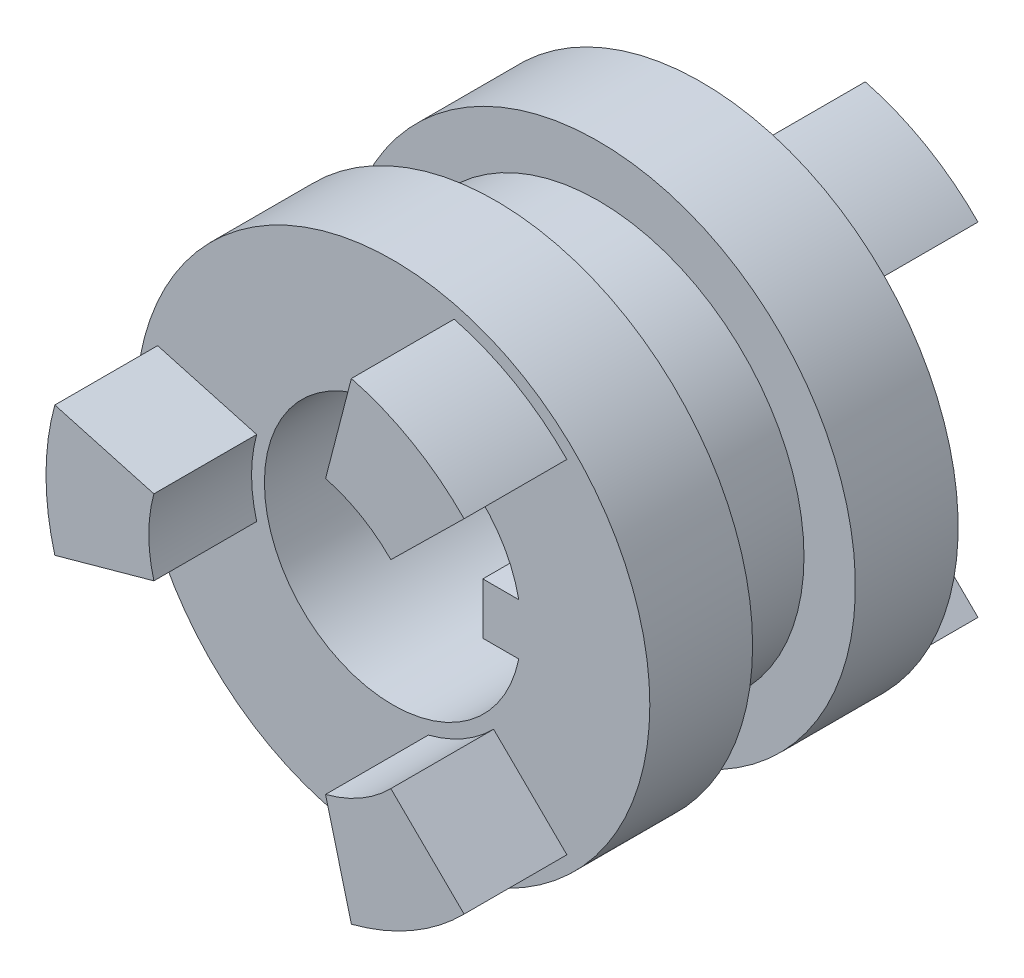
ISO-10303-21;
HEADER;
FILE_DESCRIPTION(('STEP AP214'),'2;1');
FILE_NAME('part.step','',(''),(''),'','','');
FILE_SCHEMA(('AUTOMOTIVE_DESIGN { 1 0 10303 214 1 1 1 1 }'));
ENDSEC;
DATA;
#1=APPLICATION_CONTEXT('core data for automotive mechanical design processes');
#2=APPLICATION_PROTOCOL_DEFINITION('international standard','automotive_design',2000,#1);
#3=PRODUCT_CONTEXT('',#1,'mechanical');
#4=PRODUCT('Part','Part','',(#3));
#5=PRODUCT_RELATED_PRODUCT_CATEGORY('part','',(#4));
#6=PRODUCT_DEFINITION_FORMATION('','',#4);
#7=PRODUCT_DEFINITION_CONTEXT('part definition',#1,'design');
#8=PRODUCT_DEFINITION('design','',#6,#7);
#9=PRODUCT_DEFINITION_SHAPE('','',#8);
#10=(LENGTH_UNIT() NAMED_UNIT(*) SI_UNIT(.MILLI.,.METRE.));
#11=(NAMED_UNIT(*) PLANE_ANGLE_UNIT() SI_UNIT($,.RADIAN.));
#12=(NAMED_UNIT(*) SI_UNIT($,.STERADIAN.) SOLID_ANGLE_UNIT());
#13=UNCERTAINTY_MEASURE_WITH_UNIT(LENGTH_MEASURE(1.E-05),#10,'distance_accuracy_value','');
#14=(GEOMETRIC_REPRESENTATION_CONTEXT(3) GLOBAL_UNCERTAINTY_ASSIGNED_CONTEXT((#13)) GLOBAL_UNIT_ASSIGNED_CONTEXT((#10,
#11,#12)) REPRESENTATION_CONTEXT('',''));
#15=CARTESIAN_POINT('',(0.,0.,0.));
#16=DIRECTION('',(0.,0.,1.));
#17=DIRECTION('',(1.,0.,0.));
#18=AXIS2_PLACEMENT_3D('',#15,#16,#17);
#19=CARTESIAN_POINT('',(0.,0.,4.));
#20=DIRECTION('',(0.,0.,-1.));
#21=DIRECTION('',(-1.,0.,0.));
#22=AXIS2_PLACEMENT_3D('',#19,#20,#21);
#23=CYLINDRICAL_SURFACE('',#22,5.);
#24=CARTESIAN_POINT('',(0.,0.,-8.));
#25=DIRECTION('',(0.,0.,-1.));
#26=DIRECTION('',(-1.,0.,0.));
#27=AXIS2_PLACEMENT_3D('',#24,#25,#26);
#28=CIRCLE('',#27,5.);
#29=CARTESIAN_POINT('',(4.89897948556636,-1.,-8.));
#30=VERTEX_POINT('',#29);
#31=CARTESIAN_POINT('',(4.89897948556636,1.,-8.));
#32=VERTEX_POINT('',#31);
#33=EDGE_CURVE('E338',#30,#32,#28,.T.);
#34=ORIENTED_EDGE('',*,*,#33,.T.);
#35=DIRECTION('',(0.,0.,-1.));
#36=VECTOR('',#35,1.);
#37=CARTESIAN_POINT('',(4.89897948556636,1.,4.));
#38=LINE('',#37,#36);
#39=CARTESIAN_POINT('',(4.89897948556636,1.,4.));
#40=VERTEX_POINT('',#39);
#41=EDGE_CURVE('E50',#40,#32,#38,.T.);
#42=ORIENTED_EDGE('',*,*,#41,.F.);
#43=CARTESIAN_POINT('',(0.,0.,4.));
#44=DIRECTION('',(0.,0.,1.));
#45=DIRECTION('',(1.,0.,0.));
#46=AXIS2_PLACEMENT_3D('',#43,#44,#45);
#47=CIRCLE('',#46,5.);
#48=CARTESIAN_POINT('',(4.89897948556636,-1.,4.));
#49=VERTEX_POINT('',#48);
#50=EDGE_CURVE('E450',#40,#49,#47,.T.);
#51=ORIENTED_EDGE('',*,*,#50,.T.);
#52=DIRECTION('',(0.,0.,-1.));
#53=VECTOR('',#52,1.);
#54=CARTESIAN_POINT('',(4.89897948556636,-1.,4.));
#55=LINE('',#54,#53);
#56=EDGE_CURVE('E38',#30,#49,#55,.F.);
#57=ORIENTED_EDGE('',*,*,#56,.F.);
#58=EDGE_LOOP('',(#34,#42,#51,#57));
#59=FACE_BOUND('',#58,.T.);
#60=ADVANCED_FACE('F34',(#59),#23,.F.);
#61=CARTESIAN_POINT('',(0.,0.,0.));
#62=DIRECTION('',(0.,0.,1.));
#63=DIRECTION('',(1.,0.,0.));
#64=AXIS2_PLACEMENT_3D('',#61,#62,#63);
#65=PLANE('',#64);
#66=CARTESIAN_POINT('',(0.,0.,0.));
#67=DIRECTION('',(0.,0.,1.));
#68=DIRECTION('',(1.,0.,0.));
#69=AXIS2_PLACEMENT_3D('',#66,#67,#68);
#70=CIRCLE('',#69,10.);
#71=CARTESIAN_POINT('',(10.,0.,0.));
#72=VERTEX_POINT('',#71);
#73=EDGE_CURVE('E453',#72,#72,#70,.T.);
#74=ORIENTED_EDGE('',*,*,#73,.F.);
#75=EDGE_LOOP('',(#74));
#76=FACE_BOUND('',#75,.T.);
#77=CARTESIAN_POINT('',(0.,0.,0.));
#78=DIRECTION('',(0.,0.,-1.));
#79=DIRECTION('',(-1.,0.,0.));
#80=AXIS2_PLACEMENT_3D('',#77,#78,#79);
#81=CIRCLE('',#80,8.);
#82=CARTESIAN_POINT('',(-8.,0.,0.));
#83=VERTEX_POINT('',#82);
#84=EDGE_CURVE('E11',#83,#83,#81,.T.);
#85=ORIENTED_EDGE('',*,*,#84,.F.);
#86=EDGE_LOOP('',(#85));
#87=FACE_BOUND('',#86,.T.);
#88=ADVANCED_FACE('F467',(#76,#87),#65,.F.);
#89=CARTESIAN_POINT('',(0.,0.,4.));
#90=DIRECTION('',(0.,0.,1.));
#91=DIRECTION('',(1.,0.,0.));
#92=AXIS2_PLACEMENT_3D('',#89,#90,#91);
#93=PLANE('',#92);
#94=DIRECTION('',(-1.,0.,0.));
#95=VECTOR('',#94,1.);
#96=CARTESIAN_POINT('',(6.5,-1.,4.));
#97=LINE('',#96,#95);
#98=CARTESIAN_POINT('',(3.5,-1.,4.));
#99=VERTEX_POINT('',#98);
#100=EDGE_CURVE('E231',#49,#99,#97,.T.);
#101=ORIENTED_EDGE('',*,*,#100,.F.);
#102=ORIENTED_EDGE('',*,*,#50,.F.);
#103=DIRECTION('',(1.,0.,0.));
#104=VECTOR('',#103,1.);
#105=CARTESIAN_POINT('',(6.5,1.,4.));
#106=LINE('',#105,#104);
#107=CARTESIAN_POINT('',(3.5,1.,4.));
#108=VERTEX_POINT('',#107);
#109=EDGE_CURVE('E350',#108,#40,#106,.T.);
#110=ORIENTED_EDGE('',*,*,#109,.F.);
#111=DIRECTION('',(0.,1.,0.));
#112=VECTOR('',#111,1.);
#113=CARTESIAN_POINT('',(3.5,1.,4.));
#114=LINE('',#113,#112);
#115=EDGE_CURVE('E228',#99,#108,#114,.T.);
#116=ORIENTED_EDGE('',*,*,#115,.F.);
#117=EDGE_LOOP('',(#101,#102,#110,#116));
#118=FACE_BOUND('',#117,.T.);
#119=CARTESIAN_POINT('',(0.,0.,4.));
#120=DIRECTION('',(0.,0.,1.));
#121=DIRECTION('',(1.,0.,0.));
#122=AXIS2_PLACEMENT_3D('',#119,#120,#121);
#123=CIRCLE('',#122,5.5);
#124=CARTESIAN_POINT('',(3.92058984626385,3.85732747603526,4.));
#125=VERTEX_POINT('',#124);
#126=CARTESIAN_POINT('',(1.3802486618295,5.32399414270192,4.));
#127=VERTEX_POINT('',#126);
#128=EDGE_CURVE('E353',#125,#127,#123,.T.);
#129=ORIENTED_EDGE('',*,*,#128,.T.);
#130=DIRECTION('',(0.250954302150848,0.967998935036594,0.));
#131=VECTOR('',#130,1.);
#132=CARTESIAN_POINT('',(-3.16741076286094E-13,0.,4.));
#133=LINE('',#132,#131);
#134=CARTESIAN_POINT('',(2.38406587043289,9.1959898828483,4.));
#135=VERTEX_POINT('',#134);
#136=EDGE_CURVE('E359',#127,#135,#133,.T.);
#137=ORIENTED_EDGE('',*,*,#136,.T.);
#138=CARTESIAN_POINT('',(0.,0.,4.));
#139=DIRECTION('',(0.,0.,1.));
#140=DIRECTION('',(1.,0.,0.));
#141=AXIS2_PLACEMENT_3D('',#138,#139,#140);
#142=CIRCLE('',#141,9.5);
#143=CARTESIAN_POINT('',(6.7719279162738,6.66265654951473,4.));
#144=VERTEX_POINT('',#143);
#145=EDGE_CURVE('E371',#144,#135,#142,.T.);
#146=ORIENTED_EDGE('',*,*,#145,.F.);
#147=DIRECTION('',(0.712834517502549,0.701332268369928,0.));
#148=VECTOR('',#147,1.);
#149=CARTESIAN_POINT('',(-4.08479342547263E-13,4.1517863669842E-13,4.));
#150=LINE('',#149,#148);
#151=EDGE_CURVE('E368',#125,#144,#150,.T.);
#152=ORIENTED_EDGE('',*,*,#151,.F.);
#153=EDGE_LOOP('',(#129,#137,#146,#152));
#154=FACE_BOUND('',#153,.T.);
#155=CARTESIAN_POINT('',(0.,0.,4.));
#156=DIRECTION('',(0.,0.,1.));
#157=DIRECTION('',(1.,0.,0.));
#158=AXIS2_PLACEMENT_3D('',#155,#156,#157);
#159=CIRCLE('',#158,5.5);
#160=CARTESIAN_POINT('',(1.38024866183015,-5.3239941427008,4.));
#161=VERTEX_POINT('',#160);
#162=CARTESIAN_POINT('',(3.9205898462645,-3.85732747603413,4.));
#163=VERTEX_POINT('',#162);
#164=EDGE_CURVE('E386',#161,#163,#159,.T.);
#165=ORIENTED_EDGE('',*,*,#164,.T.);
#166=DIRECTION('',(0.712834517502549,-0.701332268369927,0.));
#167=VECTOR('',#166,1.);
#168=CARTESIAN_POINT('',(4.70526837617733E-13,4.78243746070332E-13,4.));
#169=LINE('',#168,#167);
#170=CARTESIAN_POINT('',(6.7719279162747,-6.66265654951384,4.));
#171=VERTEX_POINT('',#170);
#172=EDGE_CURVE('E391',#163,#171,#169,.T.);
#173=ORIENTED_EDGE('',*,*,#172,.T.);
#174=CARTESIAN_POINT('',(0.,0.,4.));
#175=DIRECTION('',(0.,0.,1.));
#176=DIRECTION('',(1.,0.,0.));
#177=AXIS2_PLACEMENT_3D('',#174,#175,#176);
#178=CIRCLE('',#177,9.5);
#179=CARTESIAN_POINT('',(2.38406587043363,-9.1959898828475,4.));
#180=VERTEX_POINT('',#179);
#181=EDGE_CURVE('E403',#180,#171,#178,.T.);
#182=ORIENTED_EDGE('',*,*,#181,.F.);
#183=DIRECTION('',(0.250954302150849,-0.967998935036594,0.));
#184=VECTOR('',#183,1.);
#185=CARTESIAN_POINT('',(5.63165213834055E-13,1.46000918098134E-13,4.));
#186=LINE('',#185,#184);
#187=EDGE_CURVE('E400',#161,#180,#186,.T.);
#188=ORIENTED_EDGE('',*,*,#187,.F.);
#189=EDGE_LOOP('',(#165,#173,#182,#188));
#190=FACE_BOUND('',#189,.T.);
#191=CARTESIAN_POINT('',(0.,0.,4.));
#192=DIRECTION('',(0.,0.,1.));
#193=DIRECTION('',(1.,0.,0.));
#194=AXIS2_PLACEMENT_3D('',#191,#192,#193);
#195=CIRCLE('',#194,5.5);
#196=CARTESIAN_POINT('',(-5.30083850809369,1.46666666666667,4.));
#197=VERTEX_POINT('',#196);
#198=CARTESIAN_POINT('',(-5.30083850809369,-1.46666666666666,4.));
#199=VERTEX_POINT('',#198);
#200=EDGE_CURVE('E418',#197,#199,#195,.T.);
#201=ORIENTED_EDGE('',*,*,#200,.T.);
#202=DIRECTION('',(-0.963788819653398,-0.266666666666666,0.));
#203=VECTOR('',#202,1.);
#204=CARTESIAN_POINT('',(0.,0.,4.));
#205=LINE('',#204,#203);
#206=CARTESIAN_POINT('',(-9.15599378670728,-2.53333333333333,4.));
#207=VERTEX_POINT('',#206);
#208=EDGE_CURVE('E423',#199,#207,#205,.T.);
#209=ORIENTED_EDGE('',*,*,#208,.T.);
#210=CARTESIAN_POINT('',(0.,0.,4.));
#211=DIRECTION('',(0.,0.,1.));
#212=DIRECTION('',(1.,0.,0.));
#213=AXIS2_PLACEMENT_3D('',#210,#211,#212);
#214=CIRCLE('',#213,9.5);
#215=CARTESIAN_POINT('',(-9.15599378670728,2.53333333333333,4.));
#216=VERTEX_POINT('',#215);
#217=EDGE_CURVE('E435',#216,#207,#214,.T.);
#218=ORIENTED_EDGE('',*,*,#217,.F.);
#219=DIRECTION('',(-0.963788819653397,0.266666666666667,0.));
#220=VECTOR('',#219,1.);
#221=CARTESIAN_POINT('',(0.,0.,4.));
#222=LINE('',#221,#220);
#223=EDGE_CURVE('E432',#197,#216,#222,.T.);
#224=ORIENTED_EDGE('',*,*,#223,.F.);
#225=EDGE_LOOP('',(#201,#209,#218,#224));
#226=FACE_BOUND('',#225,.T.);
#227=CARTESIAN_POINT('',(0.,0.,4.));
#228=DIRECTION('',(0.,0.,1.));
#229=DIRECTION('',(1.,0.,0.));
#230=AXIS2_PLACEMENT_3D('',#227,#228,#229);
#231=CIRCLE('',#230,10.);
#232=CARTESIAN_POINT('',(10.,0.,4.));
#233=VERTEX_POINT('',#232);
#234=EDGE_CURVE('E454',#233,#233,#231,.T.);
#235=ORIENTED_EDGE('',*,*,#234,.T.);
#236=EDGE_LOOP('',(#235));
#237=FACE_BOUND('',#236,.T.);
#238=ADVANCED_FACE('F464',(#118,#154,#190,#226,#237),#93,.T.);
#239=CARTESIAN_POINT('',(0.,0.,4.));
#240=DIRECTION('',(0.,0.,-1.));
#241=DIRECTION('',(-1.,0.,0.));
#242=AXIS2_PLACEMENT_3D('',#239,#240,#241);
#243=CYLINDRICAL_SURFACE('',#242,10.);
#244=ORIENTED_EDGE('',*,*,#234,.F.);
#245=EDGE_LOOP('',(#244));
#246=FACE_BOUND('',#245,.T.);
#247=ORIENTED_EDGE('',*,*,#73,.T.);
#248=EDGE_LOOP('',(#247));
#249=FACE_BOUND('',#248,.T.);
#250=ADVANCED_FACE('F36',(#246,#249),#243,.T.);
#251=CARTESIAN_POINT('',(0.,0.,8.));
#252=DIRECTION('',(0.,0.,-1.));
#253=DIRECTION('',(-1.,0.,0.));
#254=AXIS2_PLACEMENT_3D('',#251,#252,#253);
#255=CYLINDRICAL_SURFACE('',#254,5.5);
#256=ORIENTED_EDGE('',*,*,#200,.F.);
#257=DIRECTION('',(0.,0.,-1.));
#258=VECTOR('',#257,1.);
#259=CARTESIAN_POINT('',(-5.30083850809369,1.46666666666667,8.));
#260=LINE('',#259,#258);
#261=CARTESIAN_POINT('',(-5.30083850809369,1.46666666666667,8.));
#262=VERTEX_POINT('',#261);
#263=EDGE_CURVE('E447',#262,#197,#260,.T.);
#264=ORIENTED_EDGE('',*,*,#263,.F.);
#265=CARTESIAN_POINT('',(0.,0.,8.));
#266=DIRECTION('',(0.,0.,1.));
#267=DIRECTION('',(1.,0.,0.));
#268=AXIS2_PLACEMENT_3D('',#265,#266,#267);
#269=CIRCLE('',#268,5.5);
#270=CARTESIAN_POINT('',(-5.30083850809369,-1.46666666666666,8.));
#271=VERTEX_POINT('',#270);
#272=EDGE_CURVE('E419',#262,#271,#269,.T.);
#273=ORIENTED_EDGE('',*,*,#272,.T.);
#274=DIRECTION('',(0.,0.,-1.));
#275=VECTOR('',#274,1.);
#276=CARTESIAN_POINT('',(-5.30083850809369,-1.46666666666666,8.));
#277=LINE('',#276,#275);
#278=EDGE_CURVE('E430',#271,#199,#277,.T.);
#279=ORIENTED_EDGE('',*,*,#278,.T.);
#280=EDGE_LOOP('',(#256,#264,#273,#279));
#281=FACE_BOUND('',#280,.T.);
#282=ADVANCED_FACE('F475',(#281),#255,.F.);
#283=CARTESIAN_POINT('',(0.,0.,8.));
#284=DIRECTION('',(-0.266666666666667,-0.963788819653397,0.));
#285=DIRECTION('',(0.963788819653397,-0.266666666666667,0.));
#286=AXIS2_PLACEMENT_3D('',#283,#284,#285);
#287=PLANE('',#286);
#288=ORIENTED_EDGE('',*,*,#223,.T.);
#289=DIRECTION('',(0.,0.,-1.));
#290=VECTOR('',#289,1.);
#291=CARTESIAN_POINT('',(-9.15599378670728,2.53333333333333,8.));
#292=LINE('',#291,#290);
#293=CARTESIAN_POINT('',(-9.15599378670728,2.53333333333333,8.));
#294=VERTEX_POINT('',#293);
#295=EDGE_CURVE('E444',#294,#216,#292,.T.);
#296=ORIENTED_EDGE('',*,*,#295,.F.);
#297=DIRECTION('',(-0.963788819653397,0.266666666666667,0.));
#298=VECTOR('',#297,1.);
#299=CARTESIAN_POINT('',(0.,0.,8.));
#300=LINE('',#299,#298);
#301=EDGE_CURVE('E422',#262,#294,#300,.T.);
#302=ORIENTED_EDGE('',*,*,#301,.F.);
#303=ORIENTED_EDGE('',*,*,#263,.T.);
#304=EDGE_LOOP('',(#288,#296,#302,#303));
#305=FACE_BOUND('',#304,.T.);
#306=ADVANCED_FACE('F485',(#305),#287,.F.);
#307=CARTESIAN_POINT('',(0.,0.,8.));
#308=DIRECTION('',(0.,0.,-1.));
#309=DIRECTION('',(-1.,0.,0.));
#310=AXIS2_PLACEMENT_3D('',#307,#308,#309);
#311=CYLINDRICAL_SURFACE('',#310,9.5);
#312=ORIENTED_EDGE('',*,*,#217,.T.);
#313=DIRECTION('',(0.,0.,-1.));
#314=VECTOR('',#313,1.);
#315=CARTESIAN_POINT('',(-9.15599378670728,-2.53333333333333,8.));
#316=LINE('',#315,#314);
#317=CARTESIAN_POINT('',(-9.15599378670728,-2.53333333333333,8.));
#318=VERTEX_POINT('',#317);
#319=EDGE_CURVE('E441',#318,#207,#316,.T.);
#320=ORIENTED_EDGE('',*,*,#319,.F.);
#321=CARTESIAN_POINT('',(0.,0.,8.));
#322=DIRECTION('',(0.,0.,1.));
#323=DIRECTION('',(1.,0.,0.));
#324=AXIS2_PLACEMENT_3D('',#321,#322,#323);
#325=CIRCLE('',#324,9.5);
#326=EDGE_CURVE('E425',#294,#318,#325,.T.);
#327=ORIENTED_EDGE('',*,*,#326,.F.);
#328=ORIENTED_EDGE('',*,*,#295,.T.);
#329=EDGE_LOOP('',(#312,#320,#327,#328));
#330=FACE_BOUND('',#329,.T.);
#331=ADVANCED_FACE('F560',(#330),#311,.T.);
#332=CARTESIAN_POINT('',(0.,0.,8.));
#333=DIRECTION('',(0.266666666666666,-0.963788819653398,0.));
#334=DIRECTION('',(0.963788819653398,0.266666666666666,0.));
#335=AXIS2_PLACEMENT_3D('',#332,#333,#334);
#336=PLANE('',#335);
#337=ORIENTED_EDGE('',*,*,#208,.F.);
#338=ORIENTED_EDGE('',*,*,#278,.F.);
#339=DIRECTION('',(-0.963788819653398,-0.266666666666666,0.));
#340=VECTOR('',#339,1.);
#341=CARTESIAN_POINT('',(0.,0.,8.));
#342=LINE('',#341,#340);
#343=EDGE_CURVE('E427',#271,#318,#342,.T.);
#344=ORIENTED_EDGE('',*,*,#343,.T.);
#345=ORIENTED_EDGE('',*,*,#319,.T.);
#346=EDGE_LOOP('',(#337,#338,#344,#345));
#347=FACE_BOUND('',#346,.T.);
#348=ADVANCED_FACE('F556',(#347),#336,.T.);
#349=CARTESIAN_POINT('',(0.,0.,8.));
#350=DIRECTION('',(0.,0.,1.));
#351=DIRECTION('',(1.,0.,0.));
#352=AXIS2_PLACEMENT_3D('',#349,#350,#351);
#353=PLANE('',#352);
#354=ORIENTED_EDGE('',*,*,#272,.F.);
#355=ORIENTED_EDGE('',*,*,#301,.T.);
#356=ORIENTED_EDGE('',*,*,#326,.T.);
#357=ORIENTED_EDGE('',*,*,#343,.F.);
#358=EDGE_LOOP('',(#354,#355,#356,#357));
#359=FACE_BOUND('',#358,.T.);
#360=ADVANCED_FACE('F552',(#359),#353,.T.);
#361=CARTESIAN_POINT('',(0.,0.,8.));
#362=DIRECTION('',(0.,0.,-1.));
#363=DIRECTION('',(-1.,0.,0.));
#364=AXIS2_PLACEMENT_3D('',#361,#362,#363);
#365=CYLINDRICAL_SURFACE('',#364,5.5);
#366=ORIENTED_EDGE('',*,*,#164,.F.);
#367=DIRECTION('',(0.,0.,-1.));
#368=VECTOR('',#367,1.);
#369=CARTESIAN_POINT('',(1.38024866183015,-5.3239941427008,8.));
#370=LINE('',#369,#368);
#371=CARTESIAN_POINT('',(1.38024866183015,-5.3239941427008,8.));
#372=VERTEX_POINT('',#371);
#373=EDGE_CURVE('E415',#372,#161,#370,.T.);
#374=ORIENTED_EDGE('',*,*,#373,.F.);
#375=CARTESIAN_POINT('',(0.,0.,8.));
#376=DIRECTION('',(0.,0.,1.));
#377=DIRECTION('',(1.,0.,0.));
#378=AXIS2_PLACEMENT_3D('',#375,#376,#377);
#379=CIRCLE('',#378,5.5);
#380=CARTESIAN_POINT('',(3.9205898462645,-3.85732747603413,8.));
#381=VERTEX_POINT('',#380);
#382=EDGE_CURVE('E387',#372,#381,#379,.T.);
#383=ORIENTED_EDGE('',*,*,#382,.T.);
#384=DIRECTION('',(0.,0.,-1.));
#385=VECTOR('',#384,1.);
#386=CARTESIAN_POINT('',(3.9205898462645,-3.85732747603413,8.));
#387=LINE('',#386,#385);
#388=EDGE_CURVE('E398',#381,#163,#387,.T.);
#389=ORIENTED_EDGE('',*,*,#388,.T.);
#390=EDGE_LOOP('',(#366,#374,#383,#389));
#391=FACE_BOUND('',#390,.T.);
#392=ADVANCED_FACE('F548',(#391),#365,.F.);
#393=CARTESIAN_POINT('',(5.63165213834055E-13,1.46000918098134E-13,8.));
#394=DIRECTION('',(0.967998935036594,0.250954302150849,0.));
#395=DIRECTION('',(-0.250954302150849,0.967998935036594,0.));
#396=AXIS2_PLACEMENT_3D('',#393,#394,#395);
#397=PLANE('',#396);
#398=ORIENTED_EDGE('',*,*,#187,.T.);
#399=DIRECTION('',(0.,0.,-1.));
#400=VECTOR('',#399,1.);
#401=CARTESIAN_POINT('',(2.38406587043355,-9.19598988284717,8.));
#402=LINE('',#401,#400);
#403=CARTESIAN_POINT('',(2.38406587043355,-9.19598988284717,8.));
#404=VERTEX_POINT('',#403);
#405=EDGE_CURVE('E412',#404,#180,#402,.T.);
#406=ORIENTED_EDGE('',*,*,#405,.F.);
#407=DIRECTION('',(0.250954302150849,-0.967998935036594,0.));
#408=VECTOR('',#407,1.);
#409=CARTESIAN_POINT('',(5.63165213834055E-13,1.46000918098134E-13,8.));
#410=LINE('',#409,#408);
#411=EDGE_CURVE('E390',#372,#404,#410,.T.);
#412=ORIENTED_EDGE('',*,*,#411,.F.);
#413=ORIENTED_EDGE('',*,*,#373,.T.);
#414=EDGE_LOOP('',(#398,#406,#412,#413));
#415=FACE_BOUND('',#414,.T.);
#416=ADVANCED_FACE('F544',(#415),#397,.F.);
#417=CARTESIAN_POINT('',(0.,0.,8.));
#418=DIRECTION('',(0.,0.,-1.));
#419=DIRECTION('',(-1.,0.,0.));
#420=AXIS2_PLACEMENT_3D('',#417,#418,#419);
#421=CYLINDRICAL_SURFACE('',#420,9.5);
#422=ORIENTED_EDGE('',*,*,#181,.T.);
#423=DIRECTION('',(0.,0.,-1.));
#424=VECTOR('',#423,1.);
#425=CARTESIAN_POINT('',(6.7719279162747,-6.66265654951384,8.));
#426=LINE('',#425,#424);
#427=CARTESIAN_POINT('',(6.7719279162747,-6.66265654951384,8.));
#428=VERTEX_POINT('',#427);
#429=EDGE_CURVE('E409',#428,#171,#426,.T.);
#430=ORIENTED_EDGE('',*,*,#429,.F.);
#431=CARTESIAN_POINT('',(0.,0.,8.));
#432=DIRECTION('',(0.,0.,1.));
#433=DIRECTION('',(1.,0.,0.));
#434=AXIS2_PLACEMENT_3D('',#431,#432,#433);
#435=CIRCLE('',#434,9.5);
#436=EDGE_CURVE('E393',#404,#428,#435,.T.);
#437=ORIENTED_EDGE('',*,*,#436,.F.);
#438=ORIENTED_EDGE('',*,*,#405,.T.);
#439=EDGE_LOOP('',(#422,#430,#437,#438));
#440=FACE_BOUND('',#439,.T.);
#441=ADVANCED_FACE('F540',(#440),#421,.T.);
#442=CARTESIAN_POINT('',(4.70526837617733E-13,4.78243746070332E-13,8.));
#443=DIRECTION('',(0.701332268369927,0.712834517502549,0.));
#444=DIRECTION('',(-0.712834517502549,0.701332268369927,0.));
#445=AXIS2_PLACEMENT_3D('',#442,#443,#444);
#446=PLANE('',#445);
#447=ORIENTED_EDGE('',*,*,#172,.F.);
#448=ORIENTED_EDGE('',*,*,#388,.F.);
#449=DIRECTION('',(0.712834517502549,-0.701332268369927,0.));
#450=VECTOR('',#449,1.);
#451=CARTESIAN_POINT('',(4.70526837617733E-13,4.78243746070332E-13,8.));
#452=LINE('',#451,#450);
#453=EDGE_CURVE('E395',#381,#428,#452,.T.);
#454=ORIENTED_EDGE('',*,*,#453,.T.);
#455=ORIENTED_EDGE('',*,*,#429,.T.);
#456=EDGE_LOOP('',(#447,#448,#454,#455));
#457=FACE_BOUND('',#456,.T.);
#458=ADVANCED_FACE('F536',(#457),#446,.T.);
#459=CARTESIAN_POINT('',(0.,0.,8.));
#460=DIRECTION('',(0.,0.,1.));
#461=DIRECTION('',(1.,0.,0.));
#462=AXIS2_PLACEMENT_3D('',#459,#460,#461);
#463=PLANE('',#462);
#464=ORIENTED_EDGE('',*,*,#382,.F.);
#465=ORIENTED_EDGE('',*,*,#411,.T.);
#466=ORIENTED_EDGE('',*,*,#436,.T.);
#467=ORIENTED_EDGE('',*,*,#453,.F.);
#468=EDGE_LOOP('',(#464,#465,#466,#467));
#469=FACE_BOUND('',#468,.T.);
#470=ADVANCED_FACE('F532',(#469),#463,.T.);
#471=CARTESIAN_POINT('',(0.,0.,8.));
#472=DIRECTION('',(0.,0.,-1.));
#473=DIRECTION('',(-1.,0.,0.));
#474=AXIS2_PLACEMENT_3D('',#471,#472,#473);
#475=CYLINDRICAL_SURFACE('',#474,5.5);
#476=ORIENTED_EDGE('',*,*,#128,.F.);
#477=DIRECTION('',(0.,0.,-1.));
#478=VECTOR('',#477,1.);
#479=CARTESIAN_POINT('',(3.92058984626385,3.85732747603526,8.));
#480=LINE('',#479,#478);
#481=CARTESIAN_POINT('',(3.92058984626385,3.85732747603526,8.));
#482=VERTEX_POINT('',#481);
#483=EDGE_CURVE('E383',#482,#125,#480,.T.);
#484=ORIENTED_EDGE('',*,*,#483,.F.);
#485=CARTESIAN_POINT('',(0.,0.,8.));
#486=DIRECTION('',(0.,0.,1.));
#487=DIRECTION('',(1.,0.,0.));
#488=AXIS2_PLACEMENT_3D('',#485,#486,#487);
#489=CIRCLE('',#488,5.5);
#490=CARTESIAN_POINT('',(1.3802486618295,5.32399414270192,8.));
#491=VERTEX_POINT('',#490);
#492=EDGE_CURVE('E355',#482,#491,#489,.T.);
#493=ORIENTED_EDGE('',*,*,#492,.T.);
#494=DIRECTION('',(0.,0.,-1.));
#495=VECTOR('',#494,1.);
#496=CARTESIAN_POINT('',(1.3802486618295,5.32399414270192,8.));
#497=LINE('',#496,#495);
#498=EDGE_CURVE('E366',#491,#127,#497,.T.);
#499=ORIENTED_EDGE('',*,*,#498,.T.);
#500=EDGE_LOOP('',(#476,#484,#493,#499));
#501=FACE_BOUND('',#500,.T.);
#502=ADVANCED_FACE('F528',(#501),#475,.F.);
#503=CARTESIAN_POINT('',(-4.08479342547263E-13,4.1517863669842E-13,8.));
#504=DIRECTION('',(-0.701332268369928,0.712834517502549,0.));
#505=DIRECTION('',(-0.712834517502549,-0.701332268369928,0.));
#506=AXIS2_PLACEMENT_3D('',#503,#504,#505);
#507=PLANE('',#506);
#508=ORIENTED_EDGE('',*,*,#151,.T.);
#509=DIRECTION('',(0.,0.,-1.));
#510=VECTOR('',#509,1.);
#511=CARTESIAN_POINT('',(6.77192791627404,6.66265654951497,8.));
#512=LINE('',#511,#510);
#513=CARTESIAN_POINT('',(6.77192791627404,6.66265654951497,8.));
#514=VERTEX_POINT('',#513);
#515=EDGE_CURVE('E380',#514,#144,#512,.T.);
#516=ORIENTED_EDGE('',*,*,#515,.F.);
#517=DIRECTION('',(0.712834517502549,0.701332268369928,0.));
#518=VECTOR('',#517,1.);
#519=CARTESIAN_POINT('',(-4.08479342547263E-13,4.1517863669842E-13,8.));
#520=LINE('',#519,#518);
#521=EDGE_CURVE('E358',#482,#514,#520,.T.);
#522=ORIENTED_EDGE('',*,*,#521,.F.);
#523=ORIENTED_EDGE('',*,*,#483,.T.);
#524=EDGE_LOOP('',(#508,#516,#522,#523));
#525=FACE_BOUND('',#524,.T.);
#526=ADVANCED_FACE('F524',(#525),#507,.F.);
#527=CARTESIAN_POINT('',(0.,0.,8.));
#528=DIRECTION('',(0.,0.,-1.));
#529=DIRECTION('',(-1.,0.,0.));
#530=AXIS2_PLACEMENT_3D('',#527,#528,#529);
#531=CYLINDRICAL_SURFACE('',#530,9.5);
#532=ORIENTED_EDGE('',*,*,#145,.T.);
#533=DIRECTION('',(0.,0.,-1.));
#534=VECTOR('',#533,1.);
#535=CARTESIAN_POINT('',(2.38406587043289,9.1959898828483,8.));
#536=LINE('',#535,#534);
#537=CARTESIAN_POINT('',(2.38406587043289,9.1959898828483,8.));
#538=VERTEX_POINT('',#537);
#539=EDGE_CURVE('E377',#538,#135,#536,.T.);
#540=ORIENTED_EDGE('',*,*,#539,.F.);
#541=CARTESIAN_POINT('',(0.,0.,8.));
#542=DIRECTION('',(0.,0.,1.));
#543=DIRECTION('',(1.,0.,0.));
#544=AXIS2_PLACEMENT_3D('',#541,#542,#543);
#545=CIRCLE('',#544,9.5);
#546=EDGE_CURVE('E361',#514,#538,#545,.T.);
#547=ORIENTED_EDGE('',*,*,#546,.F.);
#548=ORIENTED_EDGE('',*,*,#515,.T.);
#549=EDGE_LOOP('',(#532,#540,#547,#548));
#550=FACE_BOUND('',#549,.T.);
#551=ADVANCED_FACE('F520',(#550),#531,.T.);
#552=CARTESIAN_POINT('',(-3.16741076286094E-13,0.,8.));
#553=DIRECTION('',(-0.967998935036594,0.250954302150848,0.));
#554=DIRECTION('',(-0.250954302150848,-0.967998935036594,0.));
#555=AXIS2_PLACEMENT_3D('',#552,#553,#554);
#556=PLANE('',#555);
#557=ORIENTED_EDGE('',*,*,#136,.F.);
#558=ORIENTED_EDGE('',*,*,#498,.F.);
#559=DIRECTION('',(0.250954302150848,0.967998935036594,0.));
#560=VECTOR('',#559,1.);
#561=CARTESIAN_POINT('',(-3.16741076286094E-13,0.,8.));
#562=LINE('',#561,#560);
#563=EDGE_CURVE('E363',#491,#538,#562,.T.);
#564=ORIENTED_EDGE('',*,*,#563,.T.);
#565=ORIENTED_EDGE('',*,*,#539,.T.);
#566=EDGE_LOOP('',(#557,#558,#564,#565));
#567=FACE_BOUND('',#566,.T.);
#568=ADVANCED_FACE('F516',(#567),#556,.T.);
#569=CARTESIAN_POINT('',(0.,0.,8.));
#570=DIRECTION('',(0.,0.,1.));
#571=DIRECTION('',(1.,0.,0.));
#572=AXIS2_PLACEMENT_3D('',#569,#570,#571);
#573=PLANE('',#572);
#574=ORIENTED_EDGE('',*,*,#492,.F.);
#575=ORIENTED_EDGE('',*,*,#521,.T.);
#576=ORIENTED_EDGE('',*,*,#546,.T.);
#577=ORIENTED_EDGE('',*,*,#563,.F.);
#578=EDGE_LOOP('',(#574,#575,#576,#577));
#579=FACE_BOUND('',#578,.T.);
#580=ADVANCED_FACE('F513',(#579),#573,.T.);
#581=CARTESIAN_POINT('',(3.5,1.,4.));
#582=DIRECTION('',(-1.,0.,0.));
#583=DIRECTION('',(0.,0.,1.));
#584=AXIS2_PLACEMENT_3D('',#581,#582,#583);
#585=PLANE('',#584);
#586=DIRECTION('',(0.,0.,-1.));
#587=VECTOR('',#586,1.);
#588=CARTESIAN_POINT('',(3.5,1.,4.));
#589=LINE('',#588,#587);
#590=CARTESIAN_POINT('',(3.5,1.,-8.));
#591=VERTEX_POINT('',#590);
#592=EDGE_CURVE('E221',#108,#591,#589,.T.);
#593=ORIENTED_EDGE('',*,*,#592,.T.);
#594=DIRECTION('',(0.,-1.,0.));
#595=VECTOR('',#594,1.);
#596=CARTESIAN_POINT('',(3.5,0.499999999999999,-8.));
#597=LINE('',#596,#595);
#598=CARTESIAN_POINT('',(3.5,-1.,-8.));
#599=VERTEX_POINT('',#598);
#600=EDGE_CURVE('E225',#591,#599,#597,.T.);
#601=ORIENTED_EDGE('',*,*,#600,.T.);
#602=DIRECTION('',(0.,0.,-1.));
#603=VECTOR('',#602,1.);
#604=CARTESIAN_POINT('',(3.5,-1.,4.));
#605=LINE('',#604,#603);
#606=EDGE_CURVE('E230',#99,#599,#605,.T.);
#607=ORIENTED_EDGE('',*,*,#606,.F.);
#608=ORIENTED_EDGE('',*,*,#115,.T.);
#609=EDGE_LOOP('',(#593,#601,#607,#608));
#610=FACE_BOUND('',#609,.T.);
#611=ADVANCED_FACE('F223',(#610),#585,.T.);
#612=CARTESIAN_POINT('',(6.5,-1.,4.));
#613=DIRECTION('',(0.,-1.,0.));
#614=DIRECTION('',(0.,0.,-1.));
#615=AXIS2_PLACEMENT_3D('',#612,#613,#614);
#616=PLANE('',#615);
#617=ORIENTED_EDGE('',*,*,#606,.T.);
#618=DIRECTION('',(1.,0.,0.));
#619=VECTOR('',#618,1.);
#620=CARTESIAN_POINT('',(4.89897948556636,-1.,-8.));
#621=LINE('',#620,#619);
#622=EDGE_CURVE('E239',#599,#30,#621,.T.);
#623=ORIENTED_EDGE('',*,*,#622,.T.);
#624=ORIENTED_EDGE('',*,*,#56,.T.);
#625=ORIENTED_EDGE('',*,*,#100,.T.);
#626=EDGE_LOOP('',(#617,#623,#624,#625));
#627=FACE_BOUND('',#626,.T.);
#628=ADVANCED_FACE('F460',(#627),#616,.T.);
#629=CARTESIAN_POINT('',(6.5,1.,4.));
#630=DIRECTION('',(0.,1.,0.));
#631=DIRECTION('',(0.,0.,1.));
#632=AXIS2_PLACEMENT_3D('',#629,#630,#631);
#633=PLANE('',#632);
#634=DIRECTION('',(-1.,0.,0.));
#635=VECTOR('',#634,1.);
#636=CARTESIAN_POINT('',(0.,1.,-8.));
#637=LINE('',#636,#635);
#638=EDGE_CURVE('E237',#32,#591,#637,.T.);
#639=ORIENTED_EDGE('',*,*,#638,.T.);
#640=ORIENTED_EDGE('',*,*,#592,.F.);
#641=ORIENTED_EDGE('',*,*,#109,.T.);
#642=ORIENTED_EDGE('',*,*,#41,.T.);
#643=EDGE_LOOP('',(#639,#640,#641,#642));
#644=FACE_BOUND('',#643,.T.);
#645=ADVANCED_FACE('F242',(#644),#633,.T.);
#646=CARTESIAN_POINT('',(0.,0.,-4.));
#647=DIRECTION('',(0.,0.,1.));
#648=DIRECTION('',(1.,0.,0.));
#649=AXIS2_PLACEMENT_3D('',#646,#647,#648);
#650=CYLINDRICAL_SURFACE('',#649,8.);
#651=CARTESIAN_POINT('',(0.,0.,-4.));
#652=DIRECTION('',(0.,0.,-1.));
#653=DIRECTION('',(-1.,0.,0.));
#654=AXIS2_PLACEMENT_3D('',#651,#652,#653);
#655=CIRCLE('',#654,8.);
#656=CARTESIAN_POINT('',(-8.,0.,-4.));
#657=VERTEX_POINT('',#656);
#658=EDGE_CURVE('E344',#657,#657,#655,.T.);
#659=ORIENTED_EDGE('',*,*,#658,.F.);
#660=EDGE_LOOP('',(#659));
#661=FACE_BOUND('',#660,.T.);
#662=ORIENTED_EDGE('',*,*,#84,.T.);
#663=EDGE_LOOP('',(#662));
#664=FACE_BOUND('',#663,.T.);
#665=ADVANCED_FACE('F493',(#661,#664),#650,.T.);
#666=CARTESIAN_POINT('',(0.,0.,-4.));
#667=DIRECTION('',(0.,0.,-1.));
#668=DIRECTION('',(-1.,0.,0.));
#669=AXIS2_PLACEMENT_3D('',#666,#667,#668);
#670=PLANE('',#669);
#671=CARTESIAN_POINT('',(0.,0.,-4.));
#672=DIRECTION('',(0.,0.,-1.));
#673=DIRECTION('',(-1.,0.,0.));
#674=AXIS2_PLACEMENT_3D('',#671,#672,#673);
#675=CIRCLE('',#674,10.);
#676=CARTESIAN_POINT('',(-10.,0.,-4.));
#677=VERTEX_POINT('',#676);
#678=EDGE_CURVE('E340',#677,#677,#675,.T.);
#679=ORIENTED_EDGE('',*,*,#678,.F.);
#680=EDGE_LOOP('',(#679));
#681=FACE_BOUND('',#680,.T.);
#682=ORIENTED_EDGE('',*,*,#658,.T.);
#683=EDGE_LOOP('',(#682));
#684=FACE_BOUND('',#683,.T.);
#685=ADVANCED_FACE('F495',(#681,#684),#670,.F.);
#686=CARTESIAN_POINT('',(0.,0.,-8.));
#687=DIRECTION('',(0.,0.,-1.));
#688=DIRECTION('',(-1.,0.,0.));
#689=AXIS2_PLACEMENT_3D('',#686,#687,#688);
#690=PLANE('',#689);
#691=ORIENTED_EDGE('',*,*,#600,.F.);
#692=ORIENTED_EDGE('',*,*,#638,.F.);
#693=ORIENTED_EDGE('',*,*,#33,.F.);
#694=ORIENTED_EDGE('',*,*,#622,.F.);
#695=EDGE_LOOP('',(#691,#692,#693,#694));
#696=FACE_BOUND('',#695,.T.);
#697=CARTESIAN_POINT('',(0.,0.,-8.));
#698=DIRECTION('',(0.,0.,-1.));
#699=DIRECTION('',(-1.,0.,0.));
#700=AXIS2_PLACEMENT_3D('',#697,#698,#699);
#701=CIRCLE('',#700,5.49999999999984);
#702=CARTESIAN_POINT('',(-5.30083850809434,-1.46666666666648,-8.));
#703=VERTEX_POINT('',#702);
#704=CARTESIAN_POINT('',(-5.30083850809434,1.46666666666685,-8.));
#705=VERTEX_POINT('',#704);
#706=EDGE_CURVE('E243',#703,#705,#701,.T.);
#707=ORIENTED_EDGE('',*,*,#706,.T.);
#708=DIRECTION('',(-0.963788819653397,0.266666666666666,0.));
#709=VECTOR('',#708,1.);
#710=CARTESIAN_POINT('',(0.,0.,-8.));
#711=LINE('',#710,#709);
#712=CARTESIAN_POINT('',(-9.15599378670817,2.53333333333358,-8.));
#713=VERTEX_POINT('',#712);
#714=EDGE_CURVE('E251',#705,#713,#711,.T.);
#715=ORIENTED_EDGE('',*,*,#714,.T.);
#716=CARTESIAN_POINT('',(0.,0.,-8.));
#717=DIRECTION('',(0.,0.,-1.));
#718=DIRECTION('',(-1.,0.,0.));
#719=AXIS2_PLACEMENT_3D('',#716,#717,#718);
#720=CIRCLE('',#719,9.50000000000001);
#721=CARTESIAN_POINT('',(-9.15599378670738,-2.533333333333,-8.));
#722=VERTEX_POINT('',#721);
#723=EDGE_CURVE('E260',#722,#713,#720,.T.);
#724=ORIENTED_EDGE('',*,*,#723,.F.);
#725=DIRECTION('',(-0.963788819653397,-0.266666666666668,0.));
#726=VECTOR('',#725,1.);
#727=CARTESIAN_POINT('',(0.,3.44412860815365E-13,-8.));
#728=LINE('',#727,#726);
#729=EDGE_CURVE('E58',#703,#722,#728,.T.);
#730=ORIENTED_EDGE('',*,*,#729,.F.);
#731=EDGE_LOOP('',(#707,#715,#724,#730));
#732=FACE_BOUND('',#731,.T.);
#733=CARTESIAN_POINT('',(0.,0.,-8.));
#734=DIRECTION('',(0.,0.,-1.));
#735=DIRECTION('',(-1.,0.,0.));
#736=AXIS2_PLACEMENT_3D('',#733,#734,#735);
#737=CIRCLE('',#736,5.49999999999984);
#738=CARTESIAN_POINT('',(3.92058984626402,-3.85732747603461,-8.));
#739=VERTEX_POINT('',#738);
#740=CARTESIAN_POINT('',(1.38024866182966,-5.32399414270127,-8.));
#741=VERTEX_POINT('',#740);
#742=EDGE_CURVE('E274',#739,#741,#737,.T.);
#743=ORIENTED_EDGE('',*,*,#742,.T.);
#744=DIRECTION('',(0.250954302150849,-0.967998935036594,0.));
#745=VECTOR('',#744,1.);
#746=CARTESIAN_POINT('',(0.,0.,-8.));
#747=LINE('',#746,#745);
#748=CARTESIAN_POINT('',(2.38406587043312,-9.1959898828479,-8.));
#749=VERTEX_POINT('',#748);
#750=EDGE_CURVE('E279',#741,#749,#747,.T.);
#751=ORIENTED_EDGE('',*,*,#750,.T.);
#752=CARTESIAN_POINT('',(0.,0.,-8.));
#753=DIRECTION('',(0.,0.,-1.));
#754=DIRECTION('',(-1.,0.,0.));
#755=AXIS2_PLACEMENT_3D('',#752,#753,#754);
#756=CIRCLE('',#755,9.50000000000001);
#757=CARTESIAN_POINT('',(6.77192791627422,-6.66265654951432,-8.));
#758=VERTEX_POINT('',#757);
#759=EDGE_CURVE('E291',#758,#749,#756,.T.);
#760=ORIENTED_EDGE('',*,*,#759,.F.);
#761=DIRECTION('',(0.71283451750255,-0.701332268369927,0.));
#762=VECTOR('',#761,1.);
#763=CARTESIAN_POINT('',(0.,0.,-8.));
#764=LINE('',#763,#762);
#765=EDGE_CURVE('E288',#739,#758,#764,.T.);
#766=ORIENTED_EDGE('',*,*,#765,.F.);
#767=EDGE_LOOP('',(#743,#751,#760,#766));
#768=FACE_BOUND('',#767,.T.);
#769=CARTESIAN_POINT('',(0.,0.,-8.));
#770=DIRECTION('',(0.,0.,-1.));
#771=DIRECTION('',(-1.,0.,0.));
#772=AXIS2_PLACEMENT_3D('',#769,#770,#771);
#773=CIRCLE('',#772,5.49999999999984);
#774=CARTESIAN_POINT('',(1.3802486618295,5.32399414270192,-8.));
#775=VERTEX_POINT('',#774);
#776=CARTESIAN_POINT('',(3.92058984626385,3.85732747603526,-8.));
#777=VERTEX_POINT('',#776);
#778=EDGE_CURVE('E306',#775,#777,#773,.T.);
#779=ORIENTED_EDGE('',*,*,#778,.T.);
#780=DIRECTION('',(0.712834517502549,0.701332268369928,0.));
#781=VECTOR('',#780,1.);
#782=CARTESIAN_POINT('',(-4.08175188159663E-13,4.1486949400542E-13,-8.));
#783=LINE('',#782,#781);
#784=CARTESIAN_POINT('',(6.77192791627423,6.66265654951515,-8.));
#785=VERTEX_POINT('',#784);
#786=EDGE_CURVE('E311',#777,#785,#783,.T.);
#787=ORIENTED_EDGE('',*,*,#786,.T.);
#788=CARTESIAN_POINT('',(0.,0.,-8.));
#789=DIRECTION('',(0.,0.,-1.));
#790=DIRECTION('',(-1.,0.,0.));
#791=AXIS2_PLACEMENT_3D('',#788,#789,#790);
#792=CIRCLE('',#791,9.50000000000001);
#793=CARTESIAN_POINT('',(2.38406587043274,9.19598988284774,-8.));
#794=VERTEX_POINT('',#793);
#795=EDGE_CURVE('E323',#794,#785,#792,.T.);
#796=ORIENTED_EDGE('',*,*,#795,.F.);
#797=DIRECTION('',(0.250954302150847,0.967998935036595,0.));
#798=VECTOR('',#797,1.);
#799=CARTESIAN_POINT('',(-3.07925221280119E-13,0.,-8.));
#800=LINE('',#799,#798);
#801=EDGE_CURVE('E320',#775,#794,#800,.T.);
#802=ORIENTED_EDGE('',*,*,#801,.F.);
#803=EDGE_LOOP('',(#779,#787,#796,#802));
#804=FACE_BOUND('',#803,.T.);
#805=CARTESIAN_POINT('',(0.,0.,-8.));
#806=DIRECTION('',(0.,0.,-1.));
#807=DIRECTION('',(-1.,0.,0.));
#808=AXIS2_PLACEMENT_3D('',#805,#806,#807);
#809=CIRCLE('',#808,10.);
#810=CARTESIAN_POINT('',(-10.,0.,-8.));
#811=VERTEX_POINT('',#810);
#812=EDGE_CURVE('E341',#811,#811,#809,.T.);
#813=ORIENTED_EDGE('',*,*,#812,.T.);
#814=EDGE_LOOP('',(#813));
#815=FACE_BOUND('',#814,.T.);
#816=ADVANCED_FACE('F235',(#696,#732,#768,#804,#815),#690,.T.);
#817=CARTESIAN_POINT('',(0.,0.,-8.));
#818=DIRECTION('',(0.,0.,1.));
#819=DIRECTION('',(1.,0.,0.));
#820=AXIS2_PLACEMENT_3D('',#817,#818,#819);
#821=CYLINDRICAL_SURFACE('',#820,10.);
#822=ORIENTED_EDGE('',*,*,#812,.F.);
#823=EDGE_LOOP('',(#822));
#824=FACE_BOUND('',#823,.T.);
#825=ORIENTED_EDGE('',*,*,#678,.T.);
#826=EDGE_LOOP('',(#825));
#827=FACE_BOUND('',#826,.T.);
#828=ADVANCED_FACE('F508',(#824,#827),#821,.T.);
#829=CARTESIAN_POINT('',(0.,0.,-12.));
#830=DIRECTION('',(0.,0.,1.));
#831=DIRECTION('',(1.,0.,0.));
#832=AXIS2_PLACEMENT_3D('',#829,#830,#831);
#833=CYLINDRICAL_SURFACE('',#832,5.49999999999984);
#834=ORIENTED_EDGE('',*,*,#778,.F.);
#835=DIRECTION('',(0.,0.,1.));
#836=VECTOR('',#835,1.);
#837=CARTESIAN_POINT('',(1.3802486618295,5.32399414270192,-12.));
#838=LINE('',#837,#836);
#839=CARTESIAN_POINT('',(1.3802486618295,5.32399414270192,-12.));
#840=VERTEX_POINT('',#839);
#841=EDGE_CURVE('E240',#840,#775,#838,.T.);
#842=ORIENTED_EDGE('',*,*,#841,.F.);
#843=CARTESIAN_POINT('',(0.,0.,-12.));
#844=DIRECTION('',(0.,0.,-1.));
#845=DIRECTION('',(-1.,0.,0.));
#846=AXIS2_PLACEMENT_3D('',#843,#844,#845);
#847=CIRCLE('',#846,5.49999999999984);
#848=CARTESIAN_POINT('',(3.92058984626385,3.85732747603526,-12.));
#849=VERTEX_POINT('',#848);
#850=EDGE_CURVE('E307',#840,#849,#847,.T.);
#851=ORIENTED_EDGE('',*,*,#850,.T.);
#852=DIRECTION('',(0.,0.,1.));
#853=VECTOR('',#852,1.);
#854=CARTESIAN_POINT('',(3.92058984626385,3.85732747603526,-12.));
#855=LINE('',#854,#853);
#856=EDGE_CURVE('E318',#849,#777,#855,.T.);
#857=ORIENTED_EDGE('',*,*,#856,.T.);
#858=EDGE_LOOP('',(#834,#842,#851,#857));
#859=FACE_BOUND('',#858,.T.);
#860=ADVANCED_FACE('F664',(#859),#833,.F.);
#861=CARTESIAN_POINT('',(-3.07925221280119E-13,0.,-12.));
#862=DIRECTION('',(0.967998935036595,-0.250954302150847,0.));
#863=DIRECTION('',(0.250954302150847,0.967998935036595,0.));
#864=AXIS2_PLACEMENT_3D('',#861,#862,#863);
#865=PLANE('',#864);
#866=ORIENTED_EDGE('',*,*,#801,.T.);
#867=DIRECTION('',(0.,0.,1.));
#868=VECTOR('',#867,1.);
#869=CARTESIAN_POINT('',(2.38406587043289,9.19598988284831,-12.));
#870=LINE('',#869,#868);
#871=CARTESIAN_POINT('',(2.38406587043289,9.19598988284831,-12.));
#872=VERTEX_POINT('',#871);
#873=EDGE_CURVE('E332',#872,#794,#870,.T.);
#874=ORIENTED_EDGE('',*,*,#873,.F.);
#875=DIRECTION('',(0.250954302150847,0.967998935036595,0.));
#876=VECTOR('',#875,1.);
#877=CARTESIAN_POINT('',(-3.07925221280119E-13,0.,-12.));
#878=LINE('',#877,#876);
#879=EDGE_CURVE('E310',#840,#872,#878,.T.);
#880=ORIENTED_EDGE('',*,*,#879,.F.);
#881=ORIENTED_EDGE('',*,*,#841,.T.);
#882=EDGE_LOOP('',(#866,#874,#880,#881));
#883=FACE_BOUND('',#882,.T.);
#884=ADVANCED_FACE('F671',(#883),#865,.F.);
#885=CARTESIAN_POINT('',(0.,0.,-12.));
#886=DIRECTION('',(0.,0.,1.));
#887=DIRECTION('',(1.,0.,0.));
#888=AXIS2_PLACEMENT_3D('',#885,#886,#887);
#889=CYLINDRICAL_SURFACE('',#888,9.50000000000001);
#890=ORIENTED_EDGE('',*,*,#795,.T.);
#891=DIRECTION('',(0.,0.,1.));
#892=VECTOR('',#891,1.);
#893=CARTESIAN_POINT('',(6.77192791627423,6.66265654951515,-12.));
#894=LINE('',#893,#892);
#895=CARTESIAN_POINT('',(6.77192791627423,6.66265654951515,-12.));
#896=VERTEX_POINT('',#895);
#897=EDGE_CURVE('E329',#896,#785,#894,.T.);
#898=ORIENTED_EDGE('',*,*,#897,.F.);
#899=CARTESIAN_POINT('',(0.,0.,-12.));
#900=DIRECTION('',(0.,0.,-1.));
#901=DIRECTION('',(-1.,0.,0.));
#902=AXIS2_PLACEMENT_3D('',#899,#900,#901);
#903=CIRCLE('',#902,9.50000000000001);
#904=EDGE_CURVE('E313',#872,#896,#903,.T.);
#905=ORIENTED_EDGE('',*,*,#904,.F.);
#906=ORIENTED_EDGE('',*,*,#873,.T.);
#907=EDGE_LOOP('',(#890,#898,#905,#906));
#908=FACE_BOUND('',#907,.T.);
#909=ADVANCED_FACE('F679',(#908),#889,.T.);
#910=CARTESIAN_POINT('',(-4.08175188159663E-13,4.1486949400542E-13,-12.));
#911=DIRECTION('',(0.701332268369928,-0.712834517502549,0.));
#912=DIRECTION('',(0.712834517502549,0.701332268369928,0.));
#913=AXIS2_PLACEMENT_3D('',#910,#911,#912);
#914=PLANE('',#913);
#915=ORIENTED_EDGE('',*,*,#786,.F.);
#916=ORIENTED_EDGE('',*,*,#856,.F.);
#917=DIRECTION('',(0.712834517502549,0.701332268369928,0.));
#918=VECTOR('',#917,1.);
#919=CARTESIAN_POINT('',(-4.08175188159663E-13,4.1486949400542E-13,-12.));
#920=LINE('',#919,#918);
#921=EDGE_CURVE('E315',#849,#896,#920,.T.);
#922=ORIENTED_EDGE('',*,*,#921,.T.);
#923=ORIENTED_EDGE('',*,*,#897,.T.);
#924=EDGE_LOOP('',(#915,#916,#922,#923));
#925=FACE_BOUND('',#924,.T.);
#926=ADVANCED_FACE('F687',(#925),#914,.T.);
#927=CARTESIAN_POINT('',(0.,0.,-12.));
#928=DIRECTION('',(0.,0.,-1.));
#929=DIRECTION('',(-1.,0.,0.));
#930=AXIS2_PLACEMENT_3D('',#927,#928,#929);
#931=PLANE('',#930);
#932=ORIENTED_EDGE('',*,*,#850,.F.);
#933=ORIENTED_EDGE('',*,*,#879,.T.);
#934=ORIENTED_EDGE('',*,*,#904,.T.);
#935=ORIENTED_EDGE('',*,*,#921,.F.);
#936=EDGE_LOOP('',(#932,#933,#934,#935));
#937=FACE_BOUND('',#936,.T.);
#938=ADVANCED_FACE('F695',(#937),#931,.T.);
#939=CARTESIAN_POINT('',(0.,0.,-12.));
#940=DIRECTION('',(0.,0.,1.));
#941=DIRECTION('',(1.,0.,0.));
#942=AXIS2_PLACEMENT_3D('',#939,#940,#941);
#943=CYLINDRICAL_SURFACE('',#942,5.49999999999984);
#944=ORIENTED_EDGE('',*,*,#742,.F.);
#945=DIRECTION('',(0.,0.,1.));
#946=VECTOR('',#945,1.);
#947=CARTESIAN_POINT('',(3.92058984626402,-3.85732747603461,-12.));
#948=LINE('',#947,#946);
#949=CARTESIAN_POINT('',(3.92058984626402,-3.85732747603461,-12.));
#950=VERTEX_POINT('',#949);
#951=EDGE_CURVE('E303',#950,#739,#948,.T.);
#952=ORIENTED_EDGE('',*,*,#951,.F.);
#953=CARTESIAN_POINT('',(0.,0.,-12.));
#954=DIRECTION('',(0.,0.,-1.));
#955=DIRECTION('',(-1.,0.,0.));
#956=AXIS2_PLACEMENT_3D('',#953,#954,#955);
#957=CIRCLE('',#956,5.49999999999984);
#958=CARTESIAN_POINT('',(1.38024866182966,-5.32399414270127,-12.));
#959=VERTEX_POINT('',#958);
#960=EDGE_CURVE('E275',#950,#959,#957,.T.);
#961=ORIENTED_EDGE('',*,*,#960,.T.);
#962=DIRECTION('',(0.,0.,1.));
#963=VECTOR('',#962,1.);
#964=CARTESIAN_POINT('',(1.38024866182966,-5.32399414270127,-12.));
#965=LINE('',#964,#963);
#966=EDGE_CURVE('E286',#959,#741,#965,.T.);
#967=ORIENTED_EDGE('',*,*,#966,.T.);
#968=EDGE_LOOP('',(#944,#952,#961,#967));
#969=FACE_BOUND('',#968,.T.);
#970=ADVANCED_FACE('F703',(#969),#943,.F.);
#971=CARTESIAN_POINT('',(0.,0.,-12.));
#972=DIRECTION('',(-0.701332268369927,-0.71283451750255,0.));
#973=DIRECTION('',(0.71283451750255,-0.701332268369927,0.));
#974=AXIS2_PLACEMENT_3D('',#971,#972,#973);
#975=PLANE('',#974);
#976=ORIENTED_EDGE('',*,*,#765,.T.);
#977=DIRECTION('',(0.,0.,1.));
#978=VECTOR('',#977,1.);
#979=CARTESIAN_POINT('',(6.77192791627422,-6.66265654951432,-12.));
#980=LINE('',#979,#978);
#981=CARTESIAN_POINT('',(6.77192791627422,-6.66265654951432,-12.));
#982=VERTEX_POINT('',#981);
#983=EDGE_CURVE('E300',#982,#758,#980,.T.);
#984=ORIENTED_EDGE('',*,*,#983,.F.);
#985=DIRECTION('',(0.71283451750255,-0.701332268369927,0.));
#986=VECTOR('',#985,1.);
#987=CARTESIAN_POINT('',(0.,0.,-12.));
#988=LINE('',#987,#986);
#989=EDGE_CURVE('E278',#950,#982,#988,.T.);
#990=ORIENTED_EDGE('',*,*,#989,.F.);
#991=ORIENTED_EDGE('',*,*,#951,.T.);
#992=EDGE_LOOP('',(#976,#984,#990,#991));
#993=FACE_BOUND('',#992,.T.);
#994=ADVANCED_FACE('F711',(#993),#975,.F.);
#995=CARTESIAN_POINT('',(0.,0.,-12.));
#996=DIRECTION('',(0.,0.,1.));
#997=DIRECTION('',(1.,0.,0.));
#998=AXIS2_PLACEMENT_3D('',#995,#996,#997);
#999=CYLINDRICAL_SURFACE('',#998,9.50000000000001);
#1000=ORIENTED_EDGE('',*,*,#759,.T.);
#1001=DIRECTION('',(0.,0.,1.));
#1002=VECTOR('',#1001,1.);
#1003=CARTESIAN_POINT('',(2.38406587043312,-9.1959898828479,-12.));
#1004=LINE('',#1003,#1002);
#1005=CARTESIAN_POINT('',(2.38406587043312,-9.1959898828479,-12.));
#1006=VERTEX_POINT('',#1005);
#1007=EDGE_CURVE('E297',#1006,#749,#1004,.T.);
#1008=ORIENTED_EDGE('',*,*,#1007,.F.);
#1009=CARTESIAN_POINT('',(0.,0.,-12.));
#1010=DIRECTION('',(0.,0.,-1.));
#1011=DIRECTION('',(-1.,0.,0.));
#1012=AXIS2_PLACEMENT_3D('',#1009,#1010,#1011);
#1013=CIRCLE('',#1012,9.50000000000001);
#1014=EDGE_CURVE('E281',#982,#1006,#1013,.T.);
#1015=ORIENTED_EDGE('',*,*,#1014,.F.);
#1016=ORIENTED_EDGE('',*,*,#983,.T.);
#1017=EDGE_LOOP('',(#1000,#1008,#1015,#1016));
#1018=FACE_BOUND('',#1017,.T.);
#1019=ADVANCED_FACE('F719',(#1018),#999,.T.);
#1020=CARTESIAN_POINT('',(0.,0.,-12.));
#1021=DIRECTION('',(-0.967998935036594,-0.250954302150849,0.));
#1022=DIRECTION('',(0.250954302150849,-0.967998935036594,0.));
#1023=AXIS2_PLACEMENT_3D('',#1020,#1021,#1022);
#1024=PLANE('',#1023);
#1025=ORIENTED_EDGE('',*,*,#750,.F.);
#1026=ORIENTED_EDGE('',*,*,#966,.F.);
#1027=DIRECTION('',(0.250954302150849,-0.967998935036594,0.));
#1028=VECTOR('',#1027,1.);
#1029=CARTESIAN_POINT('',(0.,0.,-12.));
#1030=LINE('',#1029,#1028);
#1031=EDGE_CURVE('E283',#959,#1006,#1030,.T.);
#1032=ORIENTED_EDGE('',*,*,#1031,.T.);
#1033=ORIENTED_EDGE('',*,*,#1007,.T.);
#1034=EDGE_LOOP('',(#1025,#1026,#1032,#1033));
#1035=FACE_BOUND('',#1034,.T.);
#1036=ADVANCED_FACE('F727',(#1035),#1024,.T.);
#1037=CARTESIAN_POINT('',(0.,0.,-12.));
#1038=DIRECTION('',(0.,0.,-1.));
#1039=DIRECTION('',(-1.,0.,0.));
#1040=AXIS2_PLACEMENT_3D('',#1037,#1038,#1039);
#1041=PLANE('',#1040);
#1042=ORIENTED_EDGE('',*,*,#960,.F.);
#1043=ORIENTED_EDGE('',*,*,#989,.T.);
#1044=ORIENTED_EDGE('',*,*,#1014,.T.);
#1045=ORIENTED_EDGE('',*,*,#1031,.F.);
#1046=EDGE_LOOP('',(#1042,#1043,#1044,#1045));
#1047=FACE_BOUND('',#1046,.T.);
#1048=ADVANCED_FACE('F735',(#1047),#1041,.T.);
#1049=CARTESIAN_POINT('',(0.,0.,-12.));
#1050=DIRECTION('',(0.,0.,1.));
#1051=DIRECTION('',(1.,0.,0.));
#1052=AXIS2_PLACEMENT_3D('',#1049,#1050,#1051);
#1053=CYLINDRICAL_SURFACE('',#1052,5.49999999999984);
#1054=ORIENTED_EDGE('',*,*,#706,.F.);
#1055=DIRECTION('',(0.,0.,1.));
#1056=VECTOR('',#1055,1.);
#1057=CARTESIAN_POINT('',(-5.30083850809434,-1.46666666666648,-12.));
#1058=LINE('',#1057,#1056);
#1059=CARTESIAN_POINT('',(-5.30083850809434,-1.46666666666648,-12.));
#1060=VERTEX_POINT('',#1059);
#1061=EDGE_CURVE('E272',#1060,#703,#1058,.T.);
#1062=ORIENTED_EDGE('',*,*,#1061,.F.);
#1063=CARTESIAN_POINT('',(0.,0.,-12.));
#1064=DIRECTION('',(0.,0.,-1.));
#1065=DIRECTION('',(-1.,0.,0.));
#1066=AXIS2_PLACEMENT_3D('',#1063,#1064,#1065);
#1067=CIRCLE('',#1066,5.49999999999984);
#1068=CARTESIAN_POINT('',(-5.30083850809434,1.46666666666685,-12.));
#1069=VERTEX_POINT('',#1068);
#1070=EDGE_CURVE('E247',#1060,#1069,#1067,.T.);
#1071=ORIENTED_EDGE('',*,*,#1070,.T.);
#1072=DIRECTION('',(0.,0.,1.));
#1073=VECTOR('',#1072,1.);
#1074=CARTESIAN_POINT('',(-5.30083850809434,1.46666666666685,-12.));
#1075=LINE('',#1074,#1073);
#1076=EDGE_CURVE('E257',#1069,#705,#1075,.T.);
#1077=ORIENTED_EDGE('',*,*,#1076,.T.);
#1078=EDGE_LOOP('',(#1054,#1062,#1071,#1077));
#1079=FACE_BOUND('',#1078,.T.);
#1080=ADVANCED_FACE('F743',(#1079),#1053,.F.);
#1081=CARTESIAN_POINT('',(0.,3.44412860815365E-13,-12.));
#1082=DIRECTION('',(-0.266666666666668,0.963788819653397,0.));
#1083=DIRECTION('',(-0.963788819653397,-0.266666666666668,0.));
#1084=AXIS2_PLACEMENT_3D('',#1081,#1082,#1083);
#1085=PLANE('',#1084);
#1086=ORIENTED_EDGE('',*,*,#729,.T.);
#1087=DIRECTION('',(0.,0.,1.));
#1088=VECTOR('',#1087,1.);
#1089=CARTESIAN_POINT('',(-9.15599378670793,-2.53333333333316,-12.));
#1090=LINE('',#1089,#1088);
#1091=CARTESIAN_POINT('',(-9.15599378670793,-2.53333333333316,-12.));
#1092=VERTEX_POINT('',#1091);
#1093=EDGE_CURVE('E269',#1092,#722,#1090,.T.);
#1094=ORIENTED_EDGE('',*,*,#1093,.F.);
#1095=DIRECTION('',(-0.963788819653397,-0.266666666666668,0.));
#1096=VECTOR('',#1095,1.);
#1097=CARTESIAN_POINT('',(0.,3.44412860815365E-13,-12.));
#1098=LINE('',#1097,#1096);
#1099=EDGE_CURVE('E250',#1060,#1092,#1098,.T.);
#1100=ORIENTED_EDGE('',*,*,#1099,.F.);
#1101=ORIENTED_EDGE('',*,*,#1061,.T.);
#1102=EDGE_LOOP('',(#1086,#1094,#1100,#1101));
#1103=FACE_BOUND('',#1102,.T.);
#1104=ADVANCED_FACE('F751',(#1103),#1085,.F.);
#1105=CARTESIAN_POINT('',(0.,0.,-12.));
#1106=DIRECTION('',(0.,0.,1.));
#1107=DIRECTION('',(1.,0.,0.));
#1108=AXIS2_PLACEMENT_3D('',#1105,#1106,#1107);
#1109=CYLINDRICAL_SURFACE('',#1108,9.50000000000001);
#1110=ORIENTED_EDGE('',*,*,#723,.T.);
#1111=DIRECTION('',(0.,0.,1.));
#1112=VECTOR('',#1111,1.);
#1113=CARTESIAN_POINT('',(-9.15599378670817,2.53333333333358,-12.));
#1114=LINE('',#1113,#1112);
#1115=CARTESIAN_POINT('',(-9.15599378670817,2.53333333333358,-12.));
#1116=VERTEX_POINT('',#1115);
#1117=EDGE_CURVE('E266',#1116,#713,#1114,.T.);
#1118=ORIENTED_EDGE('',*,*,#1117,.F.);
#1119=CARTESIAN_POINT('',(0.,0.,-12.));
#1120=DIRECTION('',(0.,0.,-1.));
#1121=DIRECTION('',(-1.,0.,0.));
#1122=AXIS2_PLACEMENT_3D('',#1119,#1120,#1121);
#1123=CIRCLE('',#1122,9.50000000000001);
#1124=EDGE_CURVE('E253',#1092,#1116,#1123,.T.);
#1125=ORIENTED_EDGE('',*,*,#1124,.F.);
#1126=ORIENTED_EDGE('',*,*,#1093,.T.);
#1127=EDGE_LOOP('',(#1110,#1118,#1125,#1126));
#1128=FACE_BOUND('',#1127,.T.);
#1129=ADVANCED_FACE('F759',(#1128),#1109,.T.);
#1130=CARTESIAN_POINT('',(0.,0.,-12.));
#1131=DIRECTION('',(0.266666666666666,0.963788819653397,0.));
#1132=DIRECTION('',(-0.963788819653397,0.266666666666666,0.));
#1133=AXIS2_PLACEMENT_3D('',#1130,#1131,#1132);
#1134=PLANE('',#1133);
#1135=ORIENTED_EDGE('',*,*,#714,.F.);
#1136=ORIENTED_EDGE('',*,*,#1076,.F.);
#1137=DIRECTION('',(-0.963788819653397,0.266666666666666,0.));
#1138=VECTOR('',#1137,1.);
#1139=CARTESIAN_POINT('',(0.,0.,-12.));
#1140=LINE('',#1139,#1138);
#1141=EDGE_CURVE('E255',#1069,#1116,#1140,.T.);
#1142=ORIENTED_EDGE('',*,*,#1141,.T.);
#1143=ORIENTED_EDGE('',*,*,#1117,.T.);
#1144=EDGE_LOOP('',(#1135,#1136,#1142,#1143));
#1145=FACE_BOUND('',#1144,.T.);
#1146=ADVANCED_FACE('F767',(#1145),#1134,.T.);
#1147=CARTESIAN_POINT('',(0.,0.,-12.));
#1148=DIRECTION('',(0.,0.,-1.));
#1149=DIRECTION('',(-1.,0.,0.));
#1150=AXIS2_PLACEMENT_3D('',#1147,#1148,#1149);
#1151=PLANE('',#1150);
#1152=ORIENTED_EDGE('',*,*,#1070,.F.);
#1153=ORIENTED_EDGE('',*,*,#1099,.T.);
#1154=ORIENTED_EDGE('',*,*,#1124,.T.);
#1155=ORIENTED_EDGE('',*,*,#1141,.F.);
#1156=EDGE_LOOP('',(#1152,#1153,#1154,#1155));
#1157=FACE_BOUND('',#1156,.T.);
#1158=ADVANCED_FACE('F775',(#1157),#1151,.T.);
#1159=CLOSED_SHELL('',(#60,#88,#238,#250,#282,#306,#331,#348,#360,#392,#416,#441,#458,#470,#502,
#526,#551,#568,#580,#611,#628,#645,#665,#685,#816,#828,#860,#884,#909,#926,#938,#970,#994,#1019,
#1036,#1048,#1080,#1104,#1129,#1146,#1158));
#1160=MANIFOLD_SOLID_BREP('B2',#1159);
#1161=ADVANCED_BREP_SHAPE_REPRESENTATION('',(#18,#1160),#14);
#1162=SHAPE_DEFINITION_REPRESENTATION(#9,#1161);
ENDSEC;
END-ISO-10303-21;
